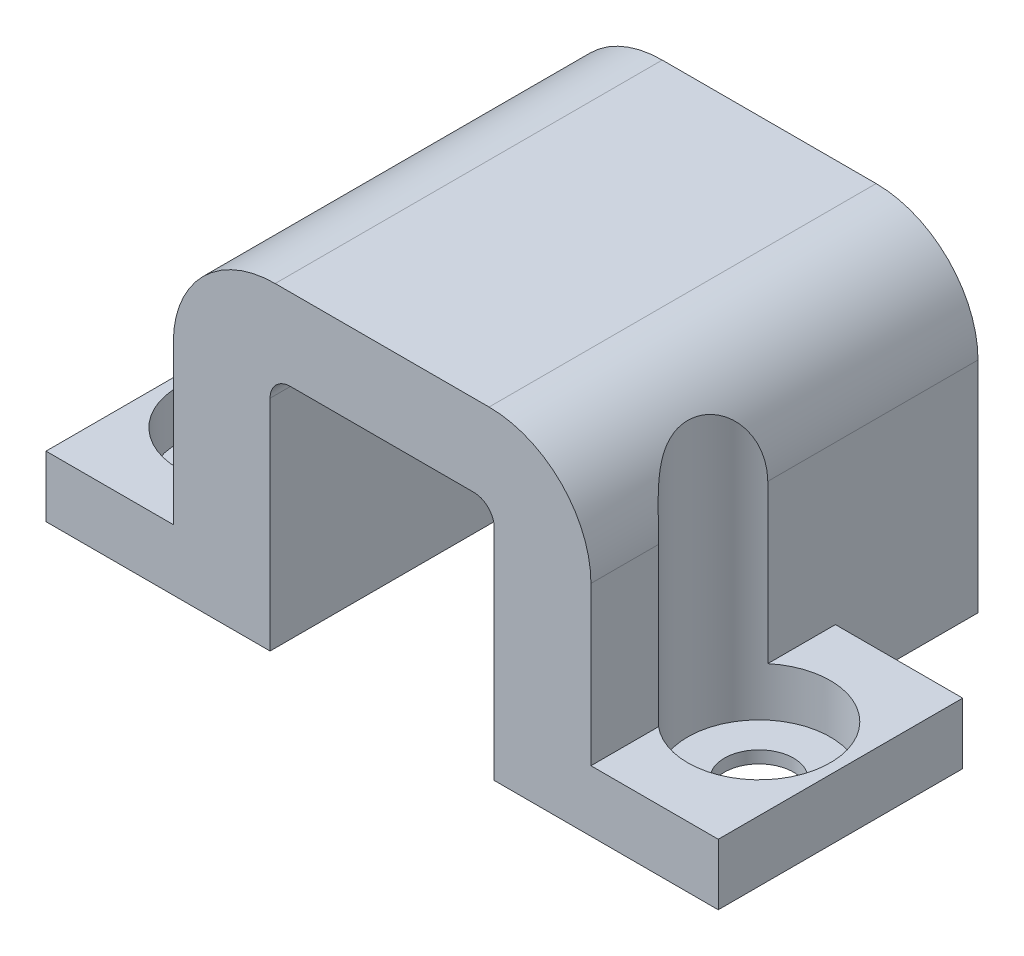
ISO-10303-21;
HEADER;
FILE_DESCRIPTION(('STEP AP214'),'2;1');
FILE_NAME('part.step','',(''),(''),'','','');
FILE_SCHEMA(('AUTOMOTIVE_DESIGN { 1 0 10303 214 1 1 1 1 }'));
ENDSEC;
DATA;
#1=APPLICATION_CONTEXT('core data for automotive mechanical design processes');
#2=APPLICATION_PROTOCOL_DEFINITION('international standard','automotive_design',2000,#1);
#3=PRODUCT_CONTEXT('',#1,'mechanical');
#4=PRODUCT('Part','Part','',(#3));
#5=PRODUCT_RELATED_PRODUCT_CATEGORY('part','',(#4));
#6=PRODUCT_DEFINITION_FORMATION('','',#4);
#7=PRODUCT_DEFINITION_CONTEXT('part definition',#1,'design');
#8=PRODUCT_DEFINITION('design','',#6,#7);
#9=PRODUCT_DEFINITION_SHAPE('','',#8);
#10=(LENGTH_UNIT() NAMED_UNIT(*) SI_UNIT(.MILLI.,.METRE.));
#11=(NAMED_UNIT(*) PLANE_ANGLE_UNIT() SI_UNIT($,.RADIAN.));
#12=(NAMED_UNIT(*) SI_UNIT($,.STERADIAN.) SOLID_ANGLE_UNIT());
#13=UNCERTAINTY_MEASURE_WITH_UNIT(LENGTH_MEASURE(1.E-05),#10,'distance_accuracy_value','');
#14=(GEOMETRIC_REPRESENTATION_CONTEXT(3) GLOBAL_UNCERTAINTY_ASSIGNED_CONTEXT((#13)) GLOBAL_UNIT_ASSIGNED_CONTEXT((#10,
#11,#12)) REPRESENTATION_CONTEXT('',''));
#15=CARTESIAN_POINT('',(0.,0.,0.));
#16=DIRECTION('',(0.,0.,1.));
#17=DIRECTION('',(1.,0.,0.));
#18=AXIS2_PLACEMENT_3D('',#15,#16,#17);
#19=CARTESIAN_POINT('',(27.4986791834777,8.,26.));
#20=DIRECTION('',(-1.,0.,0.));
#21=DIRECTION('',(0.,0.,1.));
#22=AXIS2_PLACEMENT_3D('',#19,#20,#21);
#23=PLANE('',#22);
#24=DIRECTION('',(0.,0.,-1.));
#25=VECTOR('',#24,1.);
#26=CARTESIAN_POINT('',(27.4986791834777,8.,19.));
#27=LINE('',#26,#25);
#28=CARTESIAN_POINT('',(27.4986791834777,8.,38.));
#29=VERTEX_POINT('',#28);
#30=CARTESIAN_POINT('',(27.4986791834777,8.,34.6809513236909));
#31=VERTEX_POINT('',#30);
#32=EDGE_CURVE('E208',#29,#31,#27,.T.);
#33=ORIENTED_EDGE('',*,*,#32,.T.);
#34=DIRECTION('',(0.,1.,0.));
#35=VECTOR('',#34,1.);
#36=CARTESIAN_POINT('',(27.4986791834777,-4.29949493661165,34.6809513236909));
#37=LINE('',#36,#35);
#38=CARTESIAN_POINT('',(27.4986791834777,15.75,34.6809513236909));
#39=VERTEX_POINT('',#38);
#40=EDGE_CURVE('E53',#31,#39,#37,.T.);
#41=ORIENTED_EDGE('',*,*,#40,.T.);
#42=DIRECTION('',(0.,0.,-1.));
#43=VECTOR('',#42,1.);
#44=CARTESIAN_POINT('',(27.4986791834777,15.75,38.));
#45=LINE('',#44,#43);
#46=CARTESIAN_POINT('',(27.4986791834777,15.75,38.));
#47=VERTEX_POINT('',#46);
#48=EDGE_CURVE('E319',#39,#47,#45,.F.);
#49=ORIENTED_EDGE('',*,*,#48,.T.);
#50=DIRECTION('',(0.,-1.,0.));
#51=VECTOR('',#50,1.);
#52=CARTESIAN_POINT('',(27.4986791834777,20.75,38.));
#53=LINE('',#52,#51);
#54=EDGE_CURVE('E211',#47,#29,#53,.T.);
#55=ORIENTED_EDGE('',*,*,#54,.T.);
#56=EDGE_LOOP('',(#33,#41,#49,#55));
#57=FACE_BOUND('',#56,.T.);
#58=ADVANCED_FACE('F39',(#57),#23,.F.);
#59=CARTESIAN_POINT('',(6.99867918347768,8.,19.));
#60=DIRECTION('',(1.,0.,0.));
#61=DIRECTION('',(0.,0.,-1.));
#62=AXIS2_PLACEMENT_3D('',#59,#60,#61);
#63=PLANE('',#62);
#64=DIRECTION('',(0.,0.,1.));
#65=VECTOR('',#64,1.);
#66=CARTESIAN_POINT('',(6.99867918347768,8.,19.));
#67=LINE('',#66,#65);
#68=CARTESIAN_POINT('',(6.99867918347768,8.,26.));
#69=VERTEX_POINT('',#68);
#70=CARTESIAN_POINT('',(6.99867918347768,8.,29.3190486763091));
#71=VERTEX_POINT('',#70);
#72=EDGE_CURVE('E261',#69,#71,#67,.T.);
#73=ORIENTED_EDGE('',*,*,#72,.T.);
#74=DIRECTION('',(0.,1.,0.));
#75=VECTOR('',#74,1.);
#76=CARTESIAN_POINT('',(6.99867918347768,-4.29949493661166,29.3190486763091));
#77=LINE('',#76,#75);
#78=CARTESIAN_POINT('',(6.99867918347768,15.75,29.3190486763091));
#79=VERTEX_POINT('',#78);
#80=EDGE_CURVE('E387',#71,#79,#77,.T.);
#81=ORIENTED_EDGE('',*,*,#80,.T.);
#82=DIRECTION('',(0.,0.,1.));
#83=VECTOR('',#82,1.);
#84=CARTESIAN_POINT('',(6.99867918347768,15.75,19.));
#85=LINE('',#84,#83);
#86=CARTESIAN_POINT('',(6.99867918347768,15.75,19.));
#87=VERTEX_POINT('',#86);
#88=EDGE_CURVE('E309',#79,#87,#85,.F.);
#89=ORIENTED_EDGE('',*,*,#88,.T.);
#90=DIRECTION('',(0.,-1.,0.));
#91=VECTOR('',#90,1.);
#92=CARTESIAN_POINT('',(6.99867918347768,8.,19.));
#93=LINE('',#92,#91);
#94=CARTESIAN_POINT('',(6.99867918347768,5.,19.));
#95=VERTEX_POINT('',#94);
#96=EDGE_CURVE('E278',#87,#95,#93,.T.);
#97=ORIENTED_EDGE('',*,*,#96,.T.);
#98=DIRECTION('',(0.,0.,1.));
#99=VECTOR('',#98,1.);
#100=CARTESIAN_POINT('',(6.99867918347768,5.,19.));
#101=LINE('',#100,#99);
#102=CARTESIAN_POINT('',(6.99867918347768,5.,26.));
#103=VERTEX_POINT('',#102);
#104=EDGE_CURVE('E270',#95,#103,#101,.T.);
#105=ORIENTED_EDGE('',*,*,#104,.T.);
#106=DIRECTION('',(0.,-1.,0.));
#107=VECTOR('',#106,1.);
#108=CARTESIAN_POINT('',(6.99867918347768,8.,26.));
#109=LINE('',#108,#107);
#110=EDGE_CURVE('E296',#69,#103,#109,.T.);
#111=ORIENTED_EDGE('',*,*,#110,.F.);
#112=EDGE_LOOP('',(#73,#81,#89,#97,#105,#111));
#113=FACE_BOUND('',#112,.T.);
#114=ADVANCED_FACE('F454',(#113),#63,.F.);
#115=CARTESIAN_POINT('',(0.,8.,0.));
#116=DIRECTION('',(0.,-1.,0.));
#117=DIRECTION('',(0.,0.,-1.));
#118=AXIS2_PLACEMENT_3D('',#115,#116,#117);
#119=PLANE('',#118);
#120=CARTESIAN_POINT('',(6.99867918347768,8.,34.6809513236909));
#121=VERTEX_POINT('',#120);
#122=CARTESIAN_POINT('',(6.99867918347768,8.,38.));
#123=VERTEX_POINT('',#122);
#124=EDGE_CURVE('E267',#121,#123,#67,.T.);
#125=ORIENTED_EDGE('',*,*,#124,.F.);
#126=CARTESIAN_POINT('',(4.74867918347768,8.,32.));
#127=DIRECTION('',(0.,1.,0.));
#128=DIRECTION('',(0.,0.,1.));
#129=AXIS2_PLACEMENT_3D('',#126,#127,#128);
#130=CIRCLE('',#129,3.5);
#131=EDGE_CURVE('E376',#71,#121,#130,.T.);
#132=ORIENTED_EDGE('',*,*,#131,.F.);
#133=ORIENTED_EDGE('',*,*,#72,.F.);
#134=DIRECTION('',(-1.,0.,0.));
#135=VECTOR('',#134,1.);
#136=CARTESIAN_POINT('',(6.99867918347768,8.,26.));
#137=LINE('',#136,#135);
#138=CARTESIAN_POINT('',(0.748679183477677,8.,26.));
#139=VERTEX_POINT('',#138);
#140=EDGE_CURVE('E272',#69,#139,#137,.T.);
#141=ORIENTED_EDGE('',*,*,#140,.T.);
#142=DIRECTION('',(0.,0.,1.));
#143=VECTOR('',#142,1.);
#144=CARTESIAN_POINT('',(0.748679183477677,8.,26.));
#145=LINE('',#144,#143);
#146=CARTESIAN_POINT('',(0.748679183477675,8.,38.));
#147=VERTEX_POINT('',#146);
#148=EDGE_CURVE('E271',#139,#147,#145,.T.);
#149=ORIENTED_EDGE('',*,*,#148,.T.);
#150=DIRECTION('',(1.,0.,0.));
#151=VECTOR('',#150,1.);
#152=CARTESIAN_POINT('',(0.748679183477675,8.,38.));
#153=LINE('',#152,#151);
#154=EDGE_CURVE('E276',#147,#123,#153,.T.);
#155=ORIENTED_EDGE('',*,*,#154,.T.);
#156=EDGE_LOOP('',(#125,#132,#133,#141,#149,#155));
#157=FACE_BOUND('',#156,.T.);
#158=ADVANCED_FACE('F446',(#157),#119,.F.);
#159=CARTESIAN_POINT('',(6.99867918347768,15.75,38.));
#160=VERTEX_POINT('',#159);
#161=CARTESIAN_POINT('',(6.99867918347768,15.75,34.6809513236909));
#162=VERTEX_POINT('',#161);
#163=EDGE_CURVE('E311',#160,#162,#85,.F.);
#164=ORIENTED_EDGE('',*,*,#163,.T.);
#165=DIRECTION('',(0.,1.,0.));
#166=VECTOR('',#165,1.);
#167=CARTESIAN_POINT('',(6.99867918347768,-4.29949493661166,34.6809513236909));
#168=LINE('',#167,#166);
#169=EDGE_CURVE('E500',#162,#121,#168,.F.);
#170=ORIENTED_EDGE('',*,*,#169,.T.);
#171=ORIENTED_EDGE('',*,*,#124,.T.);
#172=DIRECTION('',(0.,-1.,0.));
#173=VECTOR('',#172,1.);
#174=CARTESIAN_POINT('',(6.99867918347768,20.75,38.));
#175=LINE('',#174,#173);
#176=EDGE_CURVE('E265',#160,#123,#175,.T.);
#177=ORIENTED_EDGE('',*,*,#176,.F.);
#178=EDGE_LOOP('',(#164,#170,#171,#177));
#179=FACE_BOUND('',#178,.T.);
#180=ADVANCED_FACE('F452',(#179),#63,.F.);
#181=CARTESIAN_POINT('',(6.99867918347768,8.,26.));
#182=DIRECTION('',(0.,0.,1.));
#183=DIRECTION('',(1.,0.,0.));
#184=AXIS2_PLACEMENT_3D('',#181,#182,#183);
#185=PLANE('',#184);
#186=DIRECTION('',(-1.,0.,0.));
#187=VECTOR('',#186,1.);
#188=CARTESIAN_POINT('',(6.99867918347768,5.,26.));
#189=LINE('',#188,#187);
#190=CARTESIAN_POINT('',(0.748679183477677,5.,26.));
#191=VERTEX_POINT('',#190);
#192=EDGE_CURVE('E285',#103,#191,#189,.T.);
#193=ORIENTED_EDGE('',*,*,#192,.T.);
#194=DIRECTION('',(0.,-1.,0.));
#195=VECTOR('',#194,1.);
#196=CARTESIAN_POINT('',(0.748679183477677,8.,26.));
#197=LINE('',#196,#195);
#198=EDGE_CURVE('E294',#139,#191,#197,.T.);
#199=ORIENTED_EDGE('',*,*,#198,.F.);
#200=ORIENTED_EDGE('',*,*,#140,.F.);
#201=ORIENTED_EDGE('',*,*,#110,.T.);
#202=EDGE_LOOP('',(#193,#199,#200,#201));
#203=FACE_BOUND('',#202,.T.);
#204=ADVANCED_FACE('F465',(#203),#185,.F.);
#205=CARTESIAN_POINT('',(0.748679183477677,8.,26.));
#206=DIRECTION('',(1.,0.,0.));
#207=DIRECTION('',(0.,0.,-1.));
#208=AXIS2_PLACEMENT_3D('',#205,#206,#207);
#209=PLANE('',#208);
#210=DIRECTION('',(0.,0.,1.));
#211=VECTOR('',#210,1.);
#212=CARTESIAN_POINT('',(0.748679183477677,5.,26.));
#213=LINE('',#212,#211);
#214=CARTESIAN_POINT('',(0.748679183477675,5.,38.));
#215=VERTEX_POINT('',#214);
#216=EDGE_CURVE('E282',#191,#215,#213,.T.);
#217=ORIENTED_EDGE('',*,*,#216,.T.);
#218=DIRECTION('',(0.,-1.,0.));
#219=VECTOR('',#218,1.);
#220=CARTESIAN_POINT('',(0.748679183477675,8.,38.));
#221=LINE('',#220,#219);
#222=EDGE_CURVE('E292',#147,#215,#221,.T.);
#223=ORIENTED_EDGE('',*,*,#222,.F.);
#224=ORIENTED_EDGE('',*,*,#148,.F.);
#225=ORIENTED_EDGE('',*,*,#198,.T.);
#226=EDGE_LOOP('',(#217,#223,#224,#225));
#227=FACE_BOUND('',#226,.T.);
#228=ADVANCED_FACE('F462',(#227),#209,.F.);
#229=CARTESIAN_POINT('',(0.748679183477675,8.,38.));
#230=DIRECTION('',(0.,0.,-1.));
#231=DIRECTION('',(-1.,0.,0.));
#232=AXIS2_PLACEMENT_3D('',#229,#230,#231);
#233=PLANE('',#232);
#234=DIRECTION('',(1.,0.,0.));
#235=VECTOR('',#234,1.);
#236=CARTESIAN_POINT('',(6.99867918347768,20.75,38.));
#237=LINE('',#236,#235);
#238=CARTESIAN_POINT('',(11.9986791834777,20.75,38.));
#239=VERTEX_POINT('',#238);
#240=CARTESIAN_POINT('',(22.4986791834777,20.75,38.));
#241=VERTEX_POINT('',#240);
#242=EDGE_CURVE('E258',#239,#241,#237,.T.);
#243=ORIENTED_EDGE('',*,*,#242,.F.);
#244=CARTESIAN_POINT('',(11.9986791834777,15.75,38.));
#245=DIRECTION('',(0.,0.,-1.));
#246=DIRECTION('',(-1.,0.,0.));
#247=AXIS2_PLACEMENT_3D('',#244,#245,#246);
#248=CIRCLE('',#247,5.);
#249=EDGE_CURVE('E308',#239,#160,#248,.F.);
#250=ORIENTED_EDGE('',*,*,#249,.T.);
#251=ORIENTED_EDGE('',*,*,#176,.T.);
#252=ORIENTED_EDGE('',*,*,#154,.F.);
#253=ORIENTED_EDGE('',*,*,#222,.T.);
#254=DIRECTION('',(1.,0.,0.));
#255=VECTOR('',#254,1.);
#256=CARTESIAN_POINT('',(0.748679183477675,5.,38.));
#257=LINE('',#256,#255);
#258=CARTESIAN_POINT('',(11.7486791834777,5.,38.));
#259=VERTEX_POINT('',#258);
#260=EDGE_CURVE('E288',#215,#259,#257,.T.);
#261=ORIENTED_EDGE('',*,*,#260,.T.);
#262=DIRECTION('',(0.,-1.,0.));
#263=VECTOR('',#262,1.);
#264=CARTESIAN_POINT('',(11.7486791834777,20.75,38.));
#265=LINE('',#264,#263);
#266=CARTESIAN_POINT('',(11.7486791834777,15.75,38.));
#267=VERTEX_POINT('',#266);
#268=EDGE_CURVE('E248',#267,#259,#265,.T.);
#269=ORIENTED_EDGE('',*,*,#268,.F.);
#270=CARTESIAN_POINT('',(12.7486791834777,15.75,38.));
#271=DIRECTION('',(0.,0.,-1.));
#272=DIRECTION('',(-1.,0.,0.));
#273=AXIS2_PLACEMENT_3D('',#270,#271,#272);
#274=CIRCLE('',#273,1.);
#275=CARTESIAN_POINT('',(12.7486791834777,16.75,38.));
#276=VERTEX_POINT('',#275);
#277=EDGE_CURVE('E11',#267,#276,#274,.T.);
#278=ORIENTED_EDGE('',*,*,#277,.T.);
#279=DIRECTION('',(-1.,0.,0.));
#280=VECTOR('',#279,1.);
#281=CARTESIAN_POINT('',(42.1651670224252,16.75,38.));
#282=LINE('',#281,#280);
#283=CARTESIAN_POINT('',(21.7486791834777,16.75,38.));
#284=VERTEX_POINT('',#283);
#285=EDGE_CURVE('E246',#284,#276,#282,.T.);
#286=ORIENTED_EDGE('',*,*,#285,.F.);
#287=CARTESIAN_POINT('',(21.7486791834777,15.75,38.));
#288=DIRECTION('',(0.,0.,-1.));
#289=DIRECTION('',(-1.,0.,0.));
#290=AXIS2_PLACEMENT_3D('',#287,#288,#289);
#291=CIRCLE('',#290,1.);
#292=CARTESIAN_POINT('',(22.7486791834777,15.75,38.));
#293=VERTEX_POINT('',#292);
#294=EDGE_CURVE('E329',#284,#293,#291,.T.);
#295=ORIENTED_EDGE('',*,*,#294,.T.);
#296=DIRECTION('',(0.,1.,0.));
#297=VECTOR('',#296,1.);
#298=CARTESIAN_POINT('',(22.7486791834777,20.75,38.));
#299=LINE('',#298,#297);
#300=CARTESIAN_POINT('',(22.7486791834777,5.,38.));
#301=VERTEX_POINT('',#300);
#302=EDGE_CURVE('E213',#301,#293,#299,.T.);
#303=ORIENTED_EDGE('',*,*,#302,.F.);
#304=DIRECTION('',(1.,0.,0.));
#305=VECTOR('',#304,1.);
#306=CARTESIAN_POINT('',(33.7486791834777,5.,38.));
#307=LINE('',#306,#305);
#308=CARTESIAN_POINT('',(33.7486791834777,5.,38.));
#309=VERTEX_POINT('',#308);
#310=EDGE_CURVE('E238',#301,#309,#307,.T.);
#311=ORIENTED_EDGE('',*,*,#310,.T.);
#312=DIRECTION('',(0.,-1.,0.));
#313=VECTOR('',#312,1.);
#314=CARTESIAN_POINT('',(33.7486791834777,8.,38.));
#315=LINE('',#314,#313);
#316=CARTESIAN_POINT('',(33.7486791834777,8.,38.));
#317=VERTEX_POINT('',#316);
#318=EDGE_CURVE('E214',#317,#309,#315,.T.);
#319=ORIENTED_EDGE('',*,*,#318,.F.);
#320=DIRECTION('',(1.,0.,0.));
#321=VECTOR('',#320,1.);
#322=CARTESIAN_POINT('',(33.7486791834777,8.,38.));
#323=LINE('',#322,#321);
#324=EDGE_CURVE('E233',#29,#317,#323,.T.);
#325=ORIENTED_EDGE('',*,*,#324,.F.);
#326=ORIENTED_EDGE('',*,*,#54,.F.);
#327=CARTESIAN_POINT('',(22.4986791834777,15.75,38.));
#328=DIRECTION('',(0.,0.,-1.));
#329=DIRECTION('',(-1.,0.,0.));
#330=AXIS2_PLACEMENT_3D('',#327,#328,#329);
#331=CIRCLE('',#330,5.);
#332=EDGE_CURVE('E306',#47,#241,#331,.F.);
#333=ORIENTED_EDGE('',*,*,#332,.T.);
#334=EDGE_LOOP('',(#243,#250,#251,#252,#253,#261,#269,#278,#286,#295,#303,#311,#319,#325,#326,#333));
#335=FACE_BOUND('',#334,.T.);
#336=ADVANCED_FACE('F353',(#335),#233,.F.);
#337=CARTESIAN_POINT('',(10.9986791834777,8.,19.));
#338=DIRECTION('',(0.,0.,1.));
#339=DIRECTION('',(1.,0.,0.));
#340=AXIS2_PLACEMENT_3D('',#337,#338,#339);
#341=PLANE('',#340);
#342=ORIENTED_EDGE('',*,*,#96,.F.);
#343=CARTESIAN_POINT('',(11.9986791834777,15.75,19.));
#344=DIRECTION('',(0.,0.,1.));
#345=DIRECTION('',(1.,0.,0.));
#346=AXIS2_PLACEMENT_3D('',#343,#344,#345);
#347=CIRCLE('',#346,5.);
#348=CARTESIAN_POINT('',(11.9986791834777,20.75,19.));
#349=VERTEX_POINT('',#348);
#350=EDGE_CURVE('E317',#87,#349,#347,.F.);
#351=ORIENTED_EDGE('',*,*,#350,.T.);
#352=DIRECTION('',(-1.,0.,0.));
#353=VECTOR('',#352,1.);
#354=CARTESIAN_POINT('',(10.9986791834777,20.75,19.));
#355=LINE('',#354,#353);
#356=CARTESIAN_POINT('',(22.4986791834777,20.75,19.));
#357=VERTEX_POINT('',#356);
#358=EDGE_CURVE('E256',#357,#349,#355,.T.);
#359=ORIENTED_EDGE('',*,*,#358,.F.);
#360=CARTESIAN_POINT('',(22.4986791834777,15.75,19.));
#361=DIRECTION('',(0.,0.,1.));
#362=DIRECTION('',(1.,0.,0.));
#363=AXIS2_PLACEMENT_3D('',#360,#361,#362);
#364=CIRCLE('',#363,5.);
#365=CARTESIAN_POINT('',(27.4986791834777,15.75,19.));
#366=VERTEX_POINT('',#365);
#367=EDGE_CURVE('E313',#357,#366,#364,.F.);
#368=ORIENTED_EDGE('',*,*,#367,.T.);
#369=DIRECTION('',(0.,-1.,0.));
#370=VECTOR('',#369,1.);
#371=CARTESIAN_POINT('',(27.4986791834777,8.,19.));
#372=LINE('',#371,#370);
#373=CARTESIAN_POINT('',(27.4986791834777,5.,19.));
#374=VERTEX_POINT('',#373);
#375=EDGE_CURVE('E221',#366,#374,#372,.T.);
#376=ORIENTED_EDGE('',*,*,#375,.T.);
#377=DIRECTION('',(-1.,0.,0.));
#378=VECTOR('',#377,1.);
#379=CARTESIAN_POINT('',(27.4986791834777,5.,19.));
#380=LINE('',#379,#378);
#381=CARTESIAN_POINT('',(22.7486791834777,5.,19.));
#382=VERTEX_POINT('',#381);
#383=EDGE_CURVE('E227',#374,#382,#380,.T.);
#384=ORIENTED_EDGE('',*,*,#383,.T.);
#385=DIRECTION('',(0.,-1.,0.));
#386=VECTOR('',#385,1.);
#387=CARTESIAN_POINT('',(22.7486791834777,20.75,19.));
#388=LINE('',#387,#386);
#389=CARTESIAN_POINT('',(22.7486791834777,15.75,19.));
#390=VERTEX_POINT('',#389);
#391=EDGE_CURVE('E336',#390,#382,#388,.T.);
#392=ORIENTED_EDGE('',*,*,#391,.F.);
#393=CARTESIAN_POINT('',(21.7486791834777,15.75,19.));
#394=DIRECTION('',(0.,0.,1.));
#395=DIRECTION('',(1.,0.,0.));
#396=AXIS2_PLACEMENT_3D('',#393,#394,#395);
#397=CIRCLE('',#396,1.);
#398=CARTESIAN_POINT('',(21.7486791834777,16.75,19.));
#399=VERTEX_POINT('',#398);
#400=EDGE_CURVE('E332',#390,#399,#397,.T.);
#401=ORIENTED_EDGE('',*,*,#400,.T.);
#402=DIRECTION('',(-1.,0.,0.));
#403=VECTOR('',#402,1.);
#404=CARTESIAN_POINT('',(42.1651670224252,16.75,19.));
#405=LINE('',#404,#403);
#406=CARTESIAN_POINT('',(12.7486791834777,16.75,19.));
#407=VERTEX_POINT('',#406);
#408=EDGE_CURVE('E239',#399,#407,#405,.T.);
#409=ORIENTED_EDGE('',*,*,#408,.T.);
#410=CARTESIAN_POINT('',(12.7486791834777,15.75,19.));
#411=DIRECTION('',(0.,0.,1.));
#412=DIRECTION('',(1.,0.,0.));
#413=AXIS2_PLACEMENT_3D('',#410,#411,#412);
#414=CIRCLE('',#413,1.);
#415=CARTESIAN_POINT('',(11.7486791834777,15.75,19.));
#416=VERTEX_POINT('',#415);
#417=EDGE_CURVE('E50',#407,#416,#414,.T.);
#418=ORIENTED_EDGE('',*,*,#417,.T.);
#419=DIRECTION('',(0.,1.,0.));
#420=VECTOR('',#419,1.);
#421=CARTESIAN_POINT('',(11.7486791834777,20.75,19.));
#422=LINE('',#421,#420);
#423=CARTESIAN_POINT('',(11.7486791834777,5.,19.));
#424=VERTEX_POINT('',#423);
#425=EDGE_CURVE('E251',#424,#416,#422,.T.);
#426=ORIENTED_EDGE('',*,*,#425,.F.);
#427=DIRECTION('',(-1.,0.,0.));
#428=VECTOR('',#427,1.);
#429=CARTESIAN_POINT('',(10.9986791834777,5.,19.));
#430=LINE('',#429,#428);
#431=EDGE_CURVE('E274',#424,#95,#430,.T.);
#432=ORIENTED_EDGE('',*,*,#431,.T.);
#433=EDGE_LOOP('',(#342,#351,#359,#368,#376,#384,#392,#401,#409,#418,#426,#432));
#434=FACE_BOUND('',#433,.T.);
#435=ADVANCED_FACE('F340',(#434),#341,.F.);
#436=CARTESIAN_POINT('',(0.,5.,0.));
#437=DIRECTION('',(0.,-1.,0.));
#438=DIRECTION('',(0.,0.,-1.));
#439=AXIS2_PLACEMENT_3D('',#436,#437,#438);
#440=PLANE('',#439);
#441=CARTESIAN_POINT('',(4.74867918347768,5.,32.));
#442=DIRECTION('',(0.,1.,0.));
#443=DIRECTION('',(0.,0.,1.));
#444=AXIS2_PLACEMENT_3D('',#441,#442,#443);
#445=CIRCLE('',#444,1.7);
#446=CARTESIAN_POINT('',(4.74867918347768,5.,33.7));
#447=VERTEX_POINT('',#446);
#448=EDGE_CURVE('E203',#447,#447,#445,.T.);
#449=ORIENTED_EDGE('',*,*,#448,.T.);
#450=EDGE_LOOP('',(#449));
#451=FACE_BOUND('',#450,.T.);
#452=ORIENTED_EDGE('',*,*,#104,.F.);
#453=ORIENTED_EDGE('',*,*,#431,.F.);
#454=DIRECTION('',(0.,0.,-1.));
#455=VECTOR('',#454,1.);
#456=CARTESIAN_POINT('',(11.7486791834777,5.,38.));
#457=LINE('',#456,#455);
#458=EDGE_CURVE('E252',#259,#424,#457,.T.);
#459=ORIENTED_EDGE('',*,*,#458,.F.);
#460=ORIENTED_EDGE('',*,*,#260,.F.);
#461=ORIENTED_EDGE('',*,*,#216,.F.);
#462=ORIENTED_EDGE('',*,*,#192,.F.);
#463=EDGE_LOOP('',(#452,#453,#459,#460,#461,#462));
#464=FACE_BOUND('',#463,.T.);
#465=ADVANCED_FACE('F450',(#451,#464),#440,.T.);
#466=CARTESIAN_POINT('',(0.,20.75,0.));
#467=DIRECTION('',(0.,1.,0.));
#468=DIRECTION('',(0.,0.,1.));
#469=AXIS2_PLACEMENT_3D('',#466,#467,#468);
#470=PLANE('',#469);
#471=ORIENTED_EDGE('',*,*,#358,.T.);
#472=DIRECTION('',(0.,0.,1.));
#473=VECTOR('',#472,1.);
#474=CARTESIAN_POINT('',(11.9986791834777,20.75,38.));
#475=LINE('',#474,#473);
#476=EDGE_CURVE('E303',#349,#239,#475,.T.);
#477=ORIENTED_EDGE('',*,*,#476,.T.);
#478=ORIENTED_EDGE('',*,*,#242,.T.);
#479=DIRECTION('',(0.,0.,-1.));
#480=VECTOR('',#479,1.);
#481=CARTESIAN_POINT('',(22.4986791834777,20.75,19.));
#482=LINE('',#481,#480);
#483=EDGE_CURVE('E266',#241,#357,#482,.T.);
#484=ORIENTED_EDGE('',*,*,#483,.T.);
#485=EDGE_LOOP('',(#471,#477,#478,#484));
#486=FACE_BOUND('',#485,.T.);
#487=ADVANCED_FACE('F442',(#486),#470,.T.);
#488=CARTESIAN_POINT('',(11.7486791834777,0.,0.));
#489=DIRECTION('',(1.,0.,0.));
#490=DIRECTION('',(0.,0.,-1.));
#491=AXIS2_PLACEMENT_3D('',#488,#489,#490);
#492=PLANE('',#491);
#493=ORIENTED_EDGE('',*,*,#425,.T.);
#494=DIRECTION('',(0.,0.,-1.));
#495=VECTOR('',#494,1.);
#496=CARTESIAN_POINT('',(11.7486791834777,15.75,0.));
#497=LINE('',#496,#495);
#498=EDGE_CURVE('E326',#416,#267,#497,.F.);
#499=ORIENTED_EDGE('',*,*,#498,.T.);
#500=ORIENTED_EDGE('',*,*,#268,.T.);
#501=ORIENTED_EDGE('',*,*,#458,.T.);
#502=EDGE_LOOP('',(#493,#499,#500,#501));
#503=FACE_BOUND('',#502,.T.);
#504=ADVANCED_FACE('F439',(#503),#492,.T.);
#505=CARTESIAN_POINT('',(42.1651670224252,16.75,38.));
#506=DIRECTION('',(0.,1.,0.));
#507=DIRECTION('',(0.,0.,1.));
#508=AXIS2_PLACEMENT_3D('',#505,#506,#507);
#509=PLANE('',#508);
#510=ORIENTED_EDGE('',*,*,#408,.F.);
#511=DIRECTION('',(0.,0.,1.));
#512=VECTOR('',#511,1.);
#513=CARTESIAN_POINT('',(21.7486791834777,16.75,38.));
#514=LINE('',#513,#512);
#515=EDGE_CURVE('E324',#399,#284,#514,.T.);
#516=ORIENTED_EDGE('',*,*,#515,.T.);
#517=ORIENTED_EDGE('',*,*,#285,.T.);
#518=DIRECTION('',(0.,0.,-1.));
#519=VECTOR('',#518,1.);
#520=CARTESIAN_POINT('',(12.7486791834777,16.75,38.));
#521=LINE('',#520,#519);
#522=EDGE_CURVE('E318',#276,#407,#521,.T.);
#523=ORIENTED_EDGE('',*,*,#522,.T.);
#524=EDGE_LOOP('',(#510,#516,#517,#523));
#525=FACE_BOUND('',#524,.T.);
#526=ADVANCED_FACE('F344',(#525),#509,.F.);
#527=CARTESIAN_POINT('',(22.7486791834777,0.,0.));
#528=DIRECTION('',(-1.,0.,0.));
#529=DIRECTION('',(0.,0.,1.));
#530=AXIS2_PLACEMENT_3D('',#527,#528,#529);
#531=PLANE('',#530);
#532=ORIENTED_EDGE('',*,*,#302,.T.);
#533=DIRECTION('',(0.,0.,1.));
#534=VECTOR('',#533,1.);
#535=CARTESIAN_POINT('',(22.7486791834777,15.75,0.));
#536=LINE('',#535,#534);
#537=EDGE_CURVE('E328',#293,#390,#536,.F.);
#538=ORIENTED_EDGE('',*,*,#537,.T.);
#539=ORIENTED_EDGE('',*,*,#391,.T.);
#540=DIRECTION('',(0.,0.,1.));
#541=VECTOR('',#540,1.);
#542=CARTESIAN_POINT('',(22.7486791834777,5.,19.));
#543=LINE('',#542,#541);
#544=EDGE_CURVE('E358',#382,#301,#543,.T.);
#545=ORIENTED_EDGE('',*,*,#544,.T.);
#546=EDGE_LOOP('',(#532,#538,#539,#545));
#547=FACE_BOUND('',#546,.T.);
#548=ADVANCED_FACE('F355',(#547),#531,.T.);
#549=CARTESIAN_POINT('',(0.,8.,0.));
#550=DIRECTION('',(0.,-1.,0.));
#551=DIRECTION('',(0.,0.,-1.));
#552=AXIS2_PLACEMENT_3D('',#549,#550,#551);
#553=PLANE('',#552);
#554=CARTESIAN_POINT('',(27.4986791834777,8.,29.3190486763091));
#555=VERTEX_POINT('',#554);
#556=CARTESIAN_POINT('',(27.4986791834777,8.,26.));
#557=VERTEX_POINT('',#556);
#558=EDGE_CURVE('E191',#555,#557,#27,.T.);
#559=ORIENTED_EDGE('',*,*,#558,.F.);
#560=CARTESIAN_POINT('',(29.7486791834777,8.,32.));
#561=DIRECTION('',(0.,1.,0.));
#562=DIRECTION('',(0.,0.,1.));
#563=AXIS2_PLACEMENT_3D('',#560,#561,#562);
#564=CIRCLE('',#563,3.49999999999999);
#565=EDGE_CURVE('E196',#31,#555,#564,.T.);
#566=ORIENTED_EDGE('',*,*,#565,.F.);
#567=ORIENTED_EDGE('',*,*,#32,.F.);
#568=ORIENTED_EDGE('',*,*,#324,.T.);
#569=DIRECTION('',(0.,0.,-1.));
#570=VECTOR('',#569,1.);
#571=CARTESIAN_POINT('',(33.7486791834777,8.,26.));
#572=LINE('',#571,#570);
#573=CARTESIAN_POINT('',(33.7486791834777,8.,26.));
#574=VERTEX_POINT('',#573);
#575=EDGE_CURVE('E245',#317,#574,#572,.T.);
#576=ORIENTED_EDGE('',*,*,#575,.T.);
#577=DIRECTION('',(-1.,0.,0.));
#578=VECTOR('',#577,1.);
#579=CARTESIAN_POINT('',(27.4986791834777,8.,26.));
#580=LINE('',#579,#578);
#581=EDGE_CURVE('E206',#574,#557,#580,.T.);
#582=ORIENTED_EDGE('',*,*,#581,.T.);
#583=EDGE_LOOP('',(#559,#566,#567,#568,#576,#582));
#584=FACE_BOUND('',#583,.T.);
#585=ADVANCED_FACE('F207',(#584),#553,.F.);
#586=CARTESIAN_POINT('',(33.7486791834777,8.,26.));
#587=DIRECTION('',(-1.,0.,0.));
#588=DIRECTION('',(0.,0.,1.));
#589=AXIS2_PLACEMENT_3D('',#586,#587,#588);
#590=PLANE('',#589);
#591=DIRECTION('',(0.,0.,-1.));
#592=VECTOR('',#591,1.);
#593=CARTESIAN_POINT('',(33.7486791834777,5.,26.));
#594=LINE('',#593,#592);
#595=CARTESIAN_POINT('',(33.7486791834777,5.,26.));
#596=VERTEX_POINT('',#595);
#597=EDGE_CURVE('E236',#309,#596,#594,.T.);
#598=ORIENTED_EDGE('',*,*,#597,.T.);
#599=DIRECTION('',(0.,-1.,0.));
#600=VECTOR('',#599,1.);
#601=CARTESIAN_POINT('',(33.7486791834777,8.,26.));
#602=LINE('',#601,#600);
#603=EDGE_CURVE('E219',#574,#596,#602,.T.);
#604=ORIENTED_EDGE('',*,*,#603,.F.);
#605=ORIENTED_EDGE('',*,*,#575,.F.);
#606=ORIENTED_EDGE('',*,*,#318,.T.);
#607=EDGE_LOOP('',(#598,#604,#605,#606));
#608=FACE_BOUND('',#607,.T.);
#609=ADVANCED_FACE('F422',(#608),#590,.F.);
#610=CARTESIAN_POINT('',(27.4986791834777,8.,26.));
#611=DIRECTION('',(0.,0.,1.));
#612=DIRECTION('',(1.,0.,0.));
#613=AXIS2_PLACEMENT_3D('',#610,#611,#612);
#614=PLANE('',#613);
#615=DIRECTION('',(-1.,0.,0.));
#616=VECTOR('',#615,1.);
#617=CARTESIAN_POINT('',(27.4986791834777,5.,26.));
#618=LINE('',#617,#616);
#619=CARTESIAN_POINT('',(27.4986791834777,5.,26.));
#620=VERTEX_POINT('',#619);
#621=EDGE_CURVE('E234',#596,#620,#618,.T.);
#622=ORIENTED_EDGE('',*,*,#621,.T.);
#623=DIRECTION('',(0.,-1.,0.));
#624=VECTOR('',#623,1.);
#625=CARTESIAN_POINT('',(27.4986791834777,8.,26.));
#626=LINE('',#625,#624);
#627=EDGE_CURVE('E222',#557,#620,#626,.T.);
#628=ORIENTED_EDGE('',*,*,#627,.F.);
#629=ORIENTED_EDGE('',*,*,#581,.F.);
#630=ORIENTED_EDGE('',*,*,#603,.T.);
#631=EDGE_LOOP('',(#622,#628,#629,#630));
#632=FACE_BOUND('',#631,.T.);
#633=ADVANCED_FACE('F424',(#632),#614,.F.);
#634=CARTESIAN_POINT('',(27.4986791834777,15.75,29.3190486763091));
#635=VERTEX_POINT('',#634);
#636=EDGE_CURVE('E195',#366,#635,#45,.F.);
#637=ORIENTED_EDGE('',*,*,#636,.T.);
#638=DIRECTION('',(0.,1.,0.));
#639=VECTOR('',#638,1.);
#640=CARTESIAN_POINT('',(27.4986791834777,-4.29949493661165,29.3190486763091));
#641=LINE('',#640,#639);
#642=EDGE_CURVE('E190',#635,#555,#641,.F.);
#643=ORIENTED_EDGE('',*,*,#642,.T.);
#644=ORIENTED_EDGE('',*,*,#558,.T.);
#645=ORIENTED_EDGE('',*,*,#627,.T.);
#646=DIRECTION('',(0.,0.,-1.));
#647=VECTOR('',#646,1.);
#648=CARTESIAN_POINT('',(27.4986791834777,5.,26.));
#649=LINE('',#648,#647);
#650=EDGE_CURVE('E229',#620,#374,#649,.T.);
#651=ORIENTED_EDGE('',*,*,#650,.T.);
#652=ORIENTED_EDGE('',*,*,#375,.F.);
#653=EDGE_LOOP('',(#637,#643,#644,#645,#651,#652));
#654=FACE_BOUND('',#653,.T.);
#655=ADVANCED_FACE('F189',(#654),#23,.F.);
#656=CARTESIAN_POINT('',(0.,5.,0.));
#657=DIRECTION('',(0.,-1.,0.));
#658=DIRECTION('',(0.,0.,-1.));
#659=AXIS2_PLACEMENT_3D('',#656,#657,#658);
#660=PLANE('',#659);
#661=CARTESIAN_POINT('',(29.7486791834777,5.,32.));
#662=DIRECTION('',(0.,1.,0.));
#663=DIRECTION('',(0.,0.,1.));
#664=AXIS2_PLACEMENT_3D('',#661,#662,#663);
#665=CIRCLE('',#664,1.7);
#666=CARTESIAN_POINT('',(29.7486791834777,5.,33.7));
#667=VERTEX_POINT('',#666);
#668=EDGE_CURVE('E359',#667,#667,#665,.T.);
#669=ORIENTED_EDGE('',*,*,#668,.T.);
#670=EDGE_LOOP('',(#669));
#671=FACE_BOUND('',#670,.T.);
#672=ORIENTED_EDGE('',*,*,#310,.F.);
#673=ORIENTED_EDGE('',*,*,#544,.F.);
#674=ORIENTED_EDGE('',*,*,#383,.F.);
#675=ORIENTED_EDGE('',*,*,#650,.F.);
#676=ORIENTED_EDGE('',*,*,#621,.F.);
#677=ORIENTED_EDGE('',*,*,#597,.F.);
#678=EDGE_LOOP('',(#672,#673,#674,#675,#676,#677));
#679=FACE_BOUND('',#678,.T.);
#680=ADVANCED_FACE('F435',(#671,#679),#660,.T.);
#681=CARTESIAN_POINT('',(11.9986791834777,15.75,0.));
#682=DIRECTION('',(0.,0.,-1.));
#683=DIRECTION('',(-1.,0.,0.));
#684=AXIS2_PLACEMENT_3D('',#681,#682,#683);
#685=CYLINDRICAL_SURFACE('',#684,5.);
#686=CARTESIAN_POINT('',(6.99867918347768,15.75,34.6809513236909));
#687=CARTESIAN_POINT('',(6.99866270629981,15.8514236130026,34.6809257184207));
#688=CARTESIAN_POINT('',(7.00176462415119,15.9528532116473,34.6783603694807));
#689=CARTESIAN_POINT('',(7.01409166298259,16.1551074760646,34.6679632823479));
#690=CARTESIAN_POINT('',(7.02331919664035,16.2559318876792,34.660129469065));
#691=CARTESIAN_POINT('',(7.0478792624409,16.4570603892382,34.6389257859736));
#692=CARTESIAN_POINT('',(7.06325892023809,16.5573542626007,34.6255131497123));
#693=CARTESIAN_POINT('',(7.09986537565147,16.75588599644,34.5927843021001));
#694=CARTESIAN_POINT('',(7.12109154057176,16.854124078153,34.5734687295269));
#695=CARTESIAN_POINT('',(7.1691005364769,17.048150417807,34.5283686879788));
#696=CARTESIAN_POINT('',(7.1959045071996,17.1439277513961,34.5025595283405));
#697=CARTESIAN_POINT('',(7.25444829296772,17.3317544742964,34.4439388440721));
#698=CARTESIAN_POINT('',(7.28618732952206,17.4238044487052,34.4111284235655));
#699=CARTESIAN_POINT('',(7.35369681629746,17.6029045539924,34.3380218869588));
#700=CARTESIAN_POINT('',(7.38945130082858,17.689972544057,34.2977550305984));
#701=CARTESIAN_POINT('',(7.46403258358159,17.8584295404381,34.2091196568048));
#702=CARTESIAN_POINT('',(7.50285805836991,17.9398209649027,34.1607546193291));
#703=CARTESIAN_POINT('',(7.59971652927526,18.130107533357,34.0323798155953));
#704=CARTESIAN_POINT('',(7.65873033660178,18.2354832649193,33.947776381123));
#705=CARTESIAN_POINT('',(7.77570816177607,18.4294371898797,33.7604684233533));
#706=CARTESIAN_POINT('',(7.83367241482547,18.5180191899119,33.6577680123046));
#707=CARTESIAN_POINT('',(7.94340656780518,18.6764524563332,33.4349830343685));
#708=CARTESIAN_POINT('',(7.99514664081449,18.7462153779279,33.3148204136377));
#709=CARTESIAN_POINT('',(8.08687016540814,18.8650339185753,33.0605265601988));
#710=CARTESIAN_POINT('',(8.126855031475,18.9140920293096,32.9263970107381));
#711=CARTESIAN_POINT('',(8.18823461325916,18.9876862196505,32.6606399388679));
#712=CARTESIAN_POINT('',(8.21093540788131,19.0139725543807,32.5297946412716));
#713=CARTESIAN_POINT('',(8.24126185453235,19.0488426886196,32.2640667731385));
#714=CARTESIAN_POINT('',(8.24889075412653,19.0574303017173,32.1291850786904));
#715=CARTESIAN_POINT('',(8.24846530476807,19.056945398815,31.8637651576356));
#716=CARTESIAN_POINT('',(8.240899256633,19.0484227370834,31.7332244552112));
#717=CARTESIAN_POINT('',(8.2116423666723,19.014788392784,31.4759368303138));
#718=CARTESIAN_POINT('',(8.18995363150671,18.9896791843984,31.3491893449612));
#719=CARTESIAN_POINT('',(8.13416645196823,18.9229189065521,31.103127072787));
#720=CARTESIAN_POINT('',(8.10007848439289,18.8812817997236,30.9838061102737));
#721=CARTESIAN_POINT('',(8.02220745788014,18.7817721759587,30.7555889659783));
#722=CARTESIAN_POINT('',(7.97842466122787,18.7239000982339,30.6466925022847));
#723=CARTESIAN_POINT('',(7.88350933961529,18.5911556015976,30.4391721164343));
#724=CARTESIAN_POINT('',(7.83222492661012,18.5159065742241,30.3408595711273));
#725=CARTESIAN_POINT('',(7.72721274733,18.3507958000057,30.1589697917531));
#726=CARTESIAN_POINT('',(7.67348434582554,18.2609302382891,30.0753964164662));
#727=CARTESIAN_POINT('',(7.56308418158974,18.0607539391309,29.9169199481993));
#728=CARTESIAN_POINT('',(7.50653353169557,17.9493697934008,29.8432943315493));
#729=CARTESIAN_POINT('',(7.3991028338408,17.7148337423332,29.7125489306604));
#730=CARTESIAN_POINT('',(7.34822616566626,17.5916749034934,29.655438952269));
#731=CARTESIAN_POINT('',(7.24781986718452,17.316516466958,29.5483641719164));
#732=CARTESIAN_POINT('',(7.19974049164055,17.1630160089454,29.5009067192404));
#733=CARTESIAN_POINT('',(7.1180077028257,16.8479891689516,29.4232837964661));
#734=CARTESIAN_POINT('',(7.08436367818755,16.6864576395958,29.3931295759589));
#735=CARTESIAN_POINT('',(7.03884979114298,16.395510177634,29.3531539024157));
#736=CARTESIAN_POINT('',(7.02379300944687,16.2669911654901,29.3402933407593));
#737=CARTESIAN_POINT('',(7.00873100632975,16.0734149683937,29.3275096544395));
#738=CARTESIAN_POINT('',(7.00496422875249,16.0088358352865,29.3243328772904));
#739=CARTESIAN_POINT('',(6.99993750606594,15.8795073829137,29.3201043337582));
#740=CARTESIAN_POINT('',(6.99867768246256,15.8147580555516,29.3190526703741));
#741=CARTESIAN_POINT('',(6.99867918347768,15.75,29.3190486763091));
#742=B_SPLINE_CURVE_WITH_KNOTS('',3,(#686,#687,#688,#689,#690,#691,#692,#693,#694,#695,#696,
#697,#698,#699,#700,#701,#702,#703,#704,#705,#706,#707,#708,#709,#710,#711,#712,#713,#714,#715,
#716,#717,#718,#719,#720,#721,#722,#723,#724,#725,#726,#727,#728,#729,#730,#731,#732,#733,#734,
#735,#736,#737,#738,#739,#740,#741),.UNSPECIFIED.,.F.,.F.,(4,2,2,2,2,2,2,2,2,2,2,2,2,2,2,2,2,2,
2,2,2,2,2,2,2,2,2,4),(0.,0.30420078638603,0.608521458558097,0.915219307079985,1.22188397847991,
1.52973278882501,1.83753308616529,2.1441502028236,2.45063589628219,2.8910228094914,
3.33130978055943,3.77362903229429,4.21589503875939,4.62001074709883,5.02403937048064,
5.41529196933019,5.80648621898243,6.19735069189473,6.58820459160246,6.98849217963918,
7.38888440967996,7.82219043898436,8.25575320981178,8.75700166335715,9.25857563238085,
9.64797413262687,9.84220039341896,10.0364360676527),.UNSPECIFIED.);
#743=EDGE_CURVE('E378',#162,#79,#742,.T.);
#744=ORIENTED_EDGE('',*,*,#743,.F.);
#745=ORIENTED_EDGE('',*,*,#163,.F.);
#746=ORIENTED_EDGE('',*,*,#249,.F.);
#747=ORIENTED_EDGE('',*,*,#476,.F.);
#748=ORIENTED_EDGE('',*,*,#350,.F.);
#749=ORIENTED_EDGE('',*,*,#88,.F.);
#750=EDGE_LOOP('',(#744,#745,#746,#747,#748,#749));
#751=FACE_BOUND('',#750,.T.);
#752=ADVANCED_FACE('F388',(#751),#685,.T.);
#753=CARTESIAN_POINT('',(22.4986791834777,15.75,0.));
#754=DIRECTION('',(0.,0.,1.));
#755=DIRECTION('',(1.,0.,0.));
#756=AXIS2_PLACEMENT_3D('',#753,#754,#755);
#757=CYLINDRICAL_SURFACE('',#756,5.);
#758=CARTESIAN_POINT('',(27.4986791834777,15.75,29.3190486763091));
#759=CARTESIAN_POINT('',(27.4986956606555,15.8514236130026,29.3190742815793));
#760=CARTESIAN_POINT('',(27.4955937428042,15.9528532116473,29.3216396305193));
#761=CARTESIAN_POINT('',(27.4832667039728,16.1551074760646,29.3320367176521));
#762=CARTESIAN_POINT('',(27.474039170315,16.2559318876792,29.3398705309349));
#763=CARTESIAN_POINT('',(27.4494791045145,16.4570603892382,29.3610742140264));
#764=CARTESIAN_POINT('',(27.4340994467173,16.5573542626007,29.3744868502877));
#765=CARTESIAN_POINT('',(27.3974929913039,16.75588599644,29.4072156978999));
#766=CARTESIAN_POINT('',(27.3762668263836,16.854124078153,29.4265312704731));
#767=CARTESIAN_POINT('',(27.3282578304785,17.048150417807,29.4716313120211));
#768=CARTESIAN_POINT('',(27.3014538597558,17.1439277513961,29.4974404716595));
#769=CARTESIAN_POINT('',(27.2429100739876,17.3317544742964,29.5560611559279));
#770=CARTESIAN_POINT('',(27.2111710374333,17.4238044487052,29.5888715764345));
#771=CARTESIAN_POINT('',(27.1436615506579,17.6029045539924,29.6619781130412));
#772=CARTESIAN_POINT('',(27.1079070661268,17.689972544057,29.7022449694016));
#773=CARTESIAN_POINT('',(27.0333257833738,17.8584295404381,29.7908803431952));
#774=CARTESIAN_POINT('',(26.9945003085854,17.9398209649027,29.8392453806709));
#775=CARTESIAN_POINT('',(26.8976418376801,18.130107533357,29.9676201844047));
#776=CARTESIAN_POINT('',(26.8386280303536,18.2354832649193,30.052223618877));
#777=CARTESIAN_POINT('',(26.7216502051793,18.4294371898797,30.2395315766467));
#778=CARTESIAN_POINT('',(26.6636859521299,18.5180191899119,30.3422319876954));
#779=CARTESIAN_POINT('',(26.5539517991502,18.6764524563332,30.5650169656315));
#780=CARTESIAN_POINT('',(26.5022117261409,18.7462153779279,30.6851795863623));
#781=CARTESIAN_POINT('',(26.4104882015472,18.8650339185753,30.9394734398012));
#782=CARTESIAN_POINT('',(26.3705033354804,18.9140920293096,31.0736029892619));
#783=CARTESIAN_POINT('',(26.3091237536962,18.9876862196505,31.3393600611321));
#784=CARTESIAN_POINT('',(26.286422959074,19.0139725543807,31.4702053587284));
#785=CARTESIAN_POINT('',(26.256096512423,19.0488426886196,31.7359332268615));
#786=CARTESIAN_POINT('',(26.2484676128288,19.0574303017173,31.8708149213096));
#787=CARTESIAN_POINT('',(26.2488930621873,19.0569453988151,32.1362348423644));
#788=CARTESIAN_POINT('',(26.2564591103224,19.0484227370834,32.2667755447888));
#789=CARTESIAN_POINT('',(26.285716000283,19.014788392784,32.5240631696862));
#790=CARTESIAN_POINT('',(26.3074047354486,18.9896791843984,32.6508106550387));
#791=CARTESIAN_POINT('',(26.3631919149871,18.9229189065521,32.896872927213));
#792=CARTESIAN_POINT('',(26.3972798825625,18.8812817997236,33.0161938897263));
#793=CARTESIAN_POINT('',(26.4751509090752,18.7817721759587,33.2444110340217));
#794=CARTESIAN_POINT('',(26.5189337057275,18.7239000982339,33.3533074977153));
#795=CARTESIAN_POINT('',(26.6138490273401,18.5911556015976,33.5608278835657));
#796=CARTESIAN_POINT('',(26.6651334403452,18.5159065742241,33.6591404288727));
#797=CARTESIAN_POINT('',(26.7701456196254,18.3507958000057,33.8410302082469));
#798=CARTESIAN_POINT('',(26.8238740211298,18.2609302382891,33.9246035835338));
#799=CARTESIAN_POINT('',(26.9342741853656,18.0607539391309,34.0830800518007));
#800=CARTESIAN_POINT('',(26.9908248352598,17.9493697934008,34.1567056684507));
#801=CARTESIAN_POINT('',(27.0982555331146,17.7148337423332,34.2874510693395));
#802=CARTESIAN_POINT('',(27.1491322012891,17.5916749034934,34.344561047731));
#803=CARTESIAN_POINT('',(27.2495384997708,17.316516466958,34.4516358280836));
#804=CARTESIAN_POINT('',(27.2976178753148,17.1630160089454,34.4990932807596));
#805=CARTESIAN_POINT('',(27.3793506641297,16.8479891689516,34.5767162035339));
#806=CARTESIAN_POINT('',(27.4129946887678,16.6864576395958,34.6068704240411));
#807=CARTESIAN_POINT('',(27.4585085758124,16.395510177634,34.6468460975843));
#808=CARTESIAN_POINT('',(27.4735653575085,16.2669911654901,34.6597066592407));
#809=CARTESIAN_POINT('',(27.4886273606256,16.0734149683937,34.6724903455605));
#810=CARTESIAN_POINT('',(27.4923941382029,16.0088358352865,34.6756671227096));
#811=CARTESIAN_POINT('',(27.4974208608894,15.8795073829137,34.6798956662418));
#812=CARTESIAN_POINT('',(27.4986806844928,15.8147580555516,34.6809473296259));
#813=CARTESIAN_POINT('',(27.4986791834777,15.75,34.6809513236909));
#814=B_SPLINE_CURVE_WITH_KNOTS('',3,(#758,#759,#760,#761,#762,#763,#764,#765,#766,#767,#768,
#769,#770,#771,#772,#773,#774,#775,#776,#777,#778,#779,#780,#781,#782,#783,#784,#785,#786,#787,
#788,#789,#790,#791,#792,#793,#794,#795,#796,#797,#798,#799,#800,#801,#802,#803,#804,#805,#806,
#807,#808,#809,#810,#811,#812,#813),.UNSPECIFIED.,.F.,.F.,(4,2,2,2,2,2,2,2,2,2,2,2,2,2,2,2,2,2,
2,2,2,2,2,2,2,2,2,4),(0.,0.304200786386027,0.608521458558097,0.915219307079982,1.22188397847991,
1.52973278882501,1.83753308616529,2.14415020282361,2.4506358962822,2.89102280949141,
3.33130978055944,3.77362903229429,4.21589503875939,4.62001074709884,5.02403937048065,
5.4152919693302,5.80648621898243,6.19735069189473,6.58820459160246,6.98849217963919,
7.38888440967997,7.82219043898436,8.25575320981178,8.75700166335716,9.25857563238085,
9.64797413262687,9.84220039341896,10.0364360676527),.UNSPECIFIED.);
#815=EDGE_CURVE('E496',#635,#39,#814,.T.);
#816=ORIENTED_EDGE('',*,*,#815,.F.);
#817=ORIENTED_EDGE('',*,*,#636,.F.);
#818=ORIENTED_EDGE('',*,*,#367,.F.);
#819=ORIENTED_EDGE('',*,*,#483,.F.);
#820=ORIENTED_EDGE('',*,*,#332,.F.);
#821=ORIENTED_EDGE('',*,*,#48,.F.);
#822=EDGE_LOOP('',(#816,#817,#818,#819,#820,#821));
#823=FACE_BOUND('',#822,.T.);
#824=ADVANCED_FACE('F494',(#823),#757,.T.);
#825=CARTESIAN_POINT('',(21.7486791834777,15.75,38.));
#826=DIRECTION('',(0.,0.,1.));
#827=DIRECTION('',(1.,0.,0.));
#828=AXIS2_PLACEMENT_3D('',#825,#826,#827);
#829=CYLINDRICAL_SURFACE('',#828,1.);
#830=ORIENTED_EDGE('',*,*,#400,.F.);
#831=ORIENTED_EDGE('',*,*,#537,.F.);
#832=ORIENTED_EDGE('',*,*,#294,.F.);
#833=ORIENTED_EDGE('',*,*,#515,.F.);
#834=EDGE_LOOP('',(#830,#831,#832,#833));
#835=FACE_BOUND('',#834,.T.);
#836=ADVANCED_FACE('F348',(#835),#829,.F.);
#837=CARTESIAN_POINT('',(12.7486791834777,15.75,38.));
#838=DIRECTION('',(0.,0.,-1.));
#839=DIRECTION('',(-1.,0.,0.));
#840=AXIS2_PLACEMENT_3D('',#837,#838,#839);
#841=CYLINDRICAL_SURFACE('',#840,1.);
#842=ORIENTED_EDGE('',*,*,#277,.F.);
#843=ORIENTED_EDGE('',*,*,#498,.F.);
#844=ORIENTED_EDGE('',*,*,#417,.F.);
#845=ORIENTED_EDGE('',*,*,#522,.F.);
#846=EDGE_LOOP('',(#842,#843,#844,#845));
#847=FACE_BOUND('',#846,.T.);
#848=ADVANCED_FACE('F41',(#847),#841,.F.);
#849=CARTESIAN_POINT('',(29.7486791834777,8.,32.));
#850=DIRECTION('',(0.,1.,0.));
#851=DIRECTION('',(0.,0.,1.));
#852=AXIS2_PLACEMENT_3D('',#849,#850,#851);
#853=CYLINDRICAL_SURFACE('',#852,1.7);
#854=ORIENTED_EDGE('',*,*,#668,.F.);
#855=EDGE_LOOP('',(#854));
#856=FACE_BOUND('',#855,.T.);
#857=CARTESIAN_POINT('',(29.7486791834777,5.6,32.));
#858=DIRECTION('',(0.,1.,0.));
#859=DIRECTION('',(0.,0.,1.));
#860=AXIS2_PLACEMENT_3D('',#857,#858,#859);
#861=CIRCLE('',#860,1.70000000000001);
#862=CARTESIAN_POINT('',(29.7486791834777,5.6,33.7));
#863=VERTEX_POINT('',#862);
#864=EDGE_CURVE('E361',#863,#863,#861,.T.);
#865=ORIENTED_EDGE('',*,*,#864,.T.);
#866=EDGE_LOOP('',(#865));
#867=FACE_BOUND('',#866,.T.);
#868=ADVANCED_FACE('F414',(#856,#867),#853,.F.);
#869=CARTESIAN_POINT('',(31.4486791834777,5.6,32.));
#870=DIRECTION('',(0.,-1.,0.));
#871=DIRECTION('',(0.,0.,-1.));
#872=AXIS2_PLACEMENT_3D('',#869,#870,#871);
#873=PLANE('',#872);
#874=ORIENTED_EDGE('',*,*,#864,.F.);
#875=EDGE_LOOP('',(#874));
#876=FACE_BOUND('',#875,.T.);
#877=CARTESIAN_POINT('',(29.7486791834777,5.6,32.));
#878=DIRECTION('',(0.,1.,0.));
#879=DIRECTION('',(0.,0.,1.));
#880=AXIS2_PLACEMENT_3D('',#877,#878,#879);
#881=CIRCLE('',#880,3.49999999999999);
#882=CARTESIAN_POINT('',(29.7486791834777,5.6,35.5));
#883=VERTEX_POINT('',#882);
#884=EDGE_CURVE('E204',#883,#883,#881,.T.);
#885=ORIENTED_EDGE('',*,*,#884,.T.);
#886=EDGE_LOOP('',(#885));
#887=FACE_BOUND('',#886,.T.);
#888=ADVANCED_FACE('F413',(#876,#887),#873,.F.);
#889=CARTESIAN_POINT('',(29.7486791834777,8.,32.));
#890=DIRECTION('',(0.,1.,0.));
#891=DIRECTION('',(0.,0.,1.));
#892=AXIS2_PLACEMENT_3D('',#889,#890,#891);
#893=CYLINDRICAL_SURFACE('',#892,3.49999999999999);
#894=ORIENTED_EDGE('',*,*,#884,.F.);
#895=EDGE_LOOP('',(#894));
#896=FACE_BOUND('',#895,.T.);
#897=ORIENTED_EDGE('',*,*,#565,.T.);
#898=ORIENTED_EDGE('',*,*,#642,.F.);
#899=ORIENTED_EDGE('',*,*,#815,.T.);
#900=ORIENTED_EDGE('',*,*,#40,.F.);
#901=EDGE_LOOP('',(#897,#898,#899,#900));
#902=FACE_BOUND('',#901,.T.);
#903=ADVANCED_FACE('F197',(#896,#902),#893,.F.);
#904=CARTESIAN_POINT('',(4.74867918347768,8.,32.));
#905=DIRECTION('',(0.,1.,0.));
#906=DIRECTION('',(0.,0.,1.));
#907=AXIS2_PLACEMENT_3D('',#904,#905,#906);
#908=CYLINDRICAL_SURFACE('',#907,1.70000000000001);
#909=ORIENTED_EDGE('',*,*,#448,.F.);
#910=EDGE_LOOP('',(#909));
#911=FACE_BOUND('',#910,.T.);
#912=CARTESIAN_POINT('',(4.74867918347768,5.6,32.));
#913=DIRECTION('',(0.,1.,0.));
#914=DIRECTION('',(0.,0.,1.));
#915=AXIS2_PLACEMENT_3D('',#912,#913,#914);
#916=CIRCLE('',#915,1.70000000000001);
#917=CARTESIAN_POINT('',(4.74867918347768,5.6,33.7));
#918=VERTEX_POINT('',#917);
#919=EDGE_CURVE('E369',#918,#918,#916,.T.);
#920=ORIENTED_EDGE('',*,*,#919,.T.);
#921=EDGE_LOOP('',(#920));
#922=FACE_BOUND('',#921,.T.);
#923=ADVANCED_FACE('F404',(#911,#922),#908,.F.);
#924=CARTESIAN_POINT('',(6.44867918347769,5.6,32.));
#925=DIRECTION('',(0.,-1.,0.));
#926=DIRECTION('',(0.,0.,-1.));
#927=AXIS2_PLACEMENT_3D('',#924,#925,#926);
#928=PLANE('',#927);
#929=ORIENTED_EDGE('',*,*,#919,.F.);
#930=EDGE_LOOP('',(#929));
#931=FACE_BOUND('',#930,.T.);
#932=CARTESIAN_POINT('',(4.74867918347768,5.6,32.));
#933=DIRECTION('',(0.,1.,0.));
#934=DIRECTION('',(0.,0.,1.));
#935=AXIS2_PLACEMENT_3D('',#932,#933,#934);
#936=CIRCLE('',#935,3.5);
#937=CARTESIAN_POINT('',(4.74867918347768,5.6,35.5));
#938=VERTEX_POINT('',#937);
#939=EDGE_CURVE('E373',#938,#938,#936,.T.);
#940=ORIENTED_EDGE('',*,*,#939,.T.);
#941=EDGE_LOOP('',(#940));
#942=FACE_BOUND('',#941,.T.);
#943=ADVANCED_FACE('F400',(#931,#942),#928,.F.);
#944=CARTESIAN_POINT('',(4.74867918347768,8.,32.));
#945=DIRECTION('',(0.,1.,0.));
#946=DIRECTION('',(0.,0.,1.));
#947=AXIS2_PLACEMENT_3D('',#944,#945,#946);
#948=CYLINDRICAL_SURFACE('',#947,3.5);
#949=ORIENTED_EDGE('',*,*,#939,.F.);
#950=EDGE_LOOP('',(#949));
#951=FACE_BOUND('',#950,.T.);
#952=ORIENTED_EDGE('',*,*,#131,.T.);
#953=ORIENTED_EDGE('',*,*,#169,.F.);
#954=ORIENTED_EDGE('',*,*,#743,.T.);
#955=ORIENTED_EDGE('',*,*,#80,.F.);
#956=EDGE_LOOP('',(#952,#953,#954,#955));
#957=FACE_BOUND('',#956,.T.);
#958=ADVANCED_FACE('F397',(#951,#957),#948,.F.);
#959=CLOSED_SHELL('',(#58,#114,#158,#180,#204,#228,#336,#435,#465,#487,#504,#526,#548,#585,#609,
#633,#655,#680,#752,#824,#836,#848,#868,#888,#903,#923,#943,#958));
#960=MANIFOLD_SOLID_BREP('B2',#959);
#961=ADVANCED_BREP_SHAPE_REPRESENTATION('',(#18,#960),#14);
#962=SHAPE_DEFINITION_REPRESENTATION(#9,#961);
ENDSEC;
END-ISO-10303-21;
